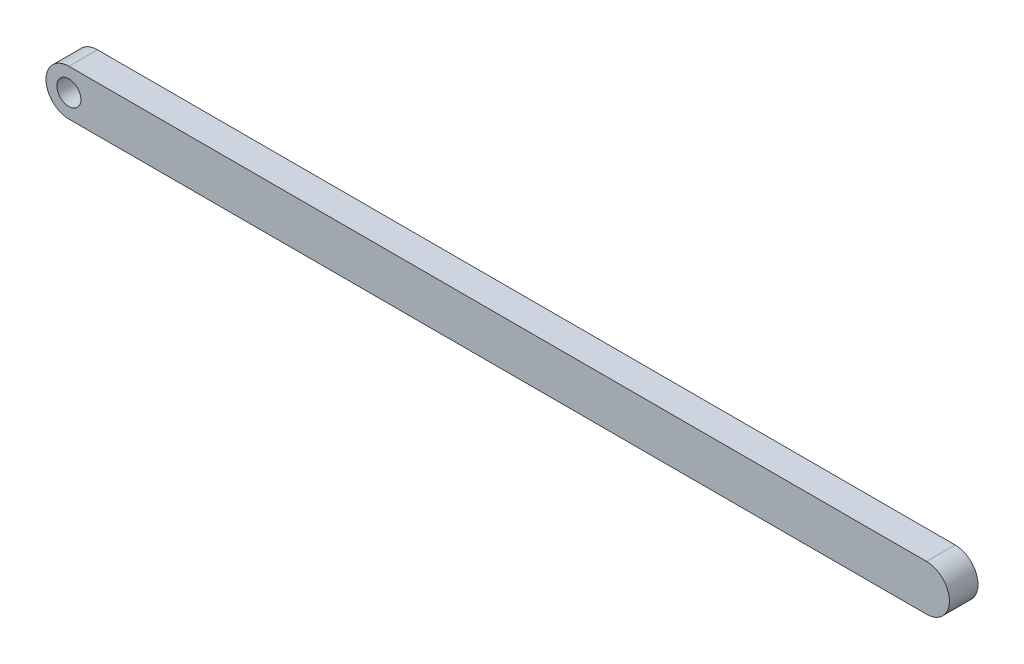
ISO-10303-21;
HEADER;
FILE_DESCRIPTION(('STEP AP214'),'2;1');
FILE_NAME('part.step','',(''),(''),'','','');
FILE_SCHEMA(('AUTOMOTIVE_DESIGN { 1 0 10303 214 1 1 1 1 }'));
ENDSEC;
DATA;
#1=APPLICATION_CONTEXT('core data for automotive mechanical design processes');
#2=APPLICATION_PROTOCOL_DEFINITION('international standard','automotive_design',2000,#1);
#3=PRODUCT_CONTEXT('',#1,'mechanical');
#4=PRODUCT('Part','Part','',(#3));
#5=PRODUCT_RELATED_PRODUCT_CATEGORY('part','',(#4));
#6=PRODUCT_DEFINITION_FORMATION('','',#4);
#7=PRODUCT_DEFINITION_CONTEXT('part definition',#1,'design');
#8=PRODUCT_DEFINITION('design','',#6,#7);
#9=PRODUCT_DEFINITION_SHAPE('','',#8);
#10=(LENGTH_UNIT() NAMED_UNIT(*) SI_UNIT(.MILLI.,.METRE.));
#11=(NAMED_UNIT(*) PLANE_ANGLE_UNIT() SI_UNIT($,.RADIAN.));
#12=(NAMED_UNIT(*) SI_UNIT($,.STERADIAN.) SOLID_ANGLE_UNIT());
#13=UNCERTAINTY_MEASURE_WITH_UNIT(LENGTH_MEASURE(1.E-05),#10,'distance_accuracy_value','');
#14=(GEOMETRIC_REPRESENTATION_CONTEXT(3) GLOBAL_UNCERTAINTY_ASSIGNED_CONTEXT((#13)) GLOBAL_UNIT_ASSIGNED_CONTEXT((#10,
#11,#12)) REPRESENTATION_CONTEXT('',''));
#15=CARTESIAN_POINT('',(0.,0.,0.));
#16=DIRECTION('',(0.,0.,1.));
#17=DIRECTION('',(1.,0.,0.));
#18=AXIS2_PLACEMENT_3D('',#15,#16,#17);
#19=CARTESIAN_POINT('',(0.,0.,2.5));
#20=DIRECTION('',(0.,0.,1.));
#21=DIRECTION('',(1.,0.,0.));
#22=AXIS2_PLACEMENT_3D('',#19,#20,#21);
#23=PLANE('',#22);
#24=CARTESIAN_POINT('',(0.,0.,2.5));
#25=DIRECTION('',(0.,0.,1.));
#26=DIRECTION('',(1.,0.,0.));
#27=AXIS2_PLACEMENT_3D('',#24,#25,#26);
#28=CIRCLE('',#27,4.);
#29=CARTESIAN_POINT('',(0.,4.,2.5));
#30=VERTEX_POINT('',#29);
#31=CARTESIAN_POINT('',(0.,-4.,2.5));
#32=VERTEX_POINT('',#31);
#33=EDGE_CURVE('E85',#30,#32,#28,.T.);
#34=ORIENTED_EDGE('',*,*,#33,.T.);
#35=DIRECTION('',(1.,0.,0.));
#36=VECTOR('',#35,1.);
#37=CARTESIAN_POINT('',(0.,-4.,2.5));
#38=LINE('',#37,#36);
#39=CARTESIAN_POINT('',(150.,-4.,2.5));
#40=VERTEX_POINT('',#39);
#41=EDGE_CURVE('E80',#32,#40,#38,.T.);
#42=ORIENTED_EDGE('',*,*,#41,.T.);
#43=CARTESIAN_POINT('',(150.,0.,2.5));
#44=DIRECTION('',(0.,0.,1.));
#45=DIRECTION('',(1.,0.,0.));
#46=AXIS2_PLACEMENT_3D('',#43,#44,#45);
#47=CIRCLE('',#46,4.);
#48=CARTESIAN_POINT('',(150.,4.,2.5));
#49=VERTEX_POINT('',#48);
#50=EDGE_CURVE('E83',#40,#49,#47,.T.);
#51=ORIENTED_EDGE('',*,*,#50,.T.);
#52=DIRECTION('',(-1.,0.,0.));
#53=VECTOR('',#52,1.);
#54=CARTESIAN_POINT('',(0.,4.,2.5));
#55=LINE('',#54,#53);
#56=EDGE_CURVE('E50',#49,#30,#55,.T.);
#57=ORIENTED_EDGE('',*,*,#56,.T.);
#58=EDGE_LOOP('',(#34,#42,#51,#57));
#59=FACE_BOUND('',#58,.T.);
#60=CARTESIAN_POINT('',(0.,0.,2.5));
#61=DIRECTION('',(0.,0.,1.));
#62=DIRECTION('',(1.,0.,0.));
#63=AXIS2_PLACEMENT_3D('',#60,#61,#62);
#64=CIRCLE('',#63,2.1);
#65=CARTESIAN_POINT('',(2.1,0.,2.5));
#66=VERTEX_POINT('',#65);
#67=EDGE_CURVE('E100',#66,#66,#64,.T.);
#68=ORIENTED_EDGE('',*,*,#67,.F.);
#69=EDGE_LOOP('',(#68));
#70=FACE_BOUND('',#69,.T.);
#71=ADVANCED_FACE('F33',(#59,#70),#23,.T.);
#72=CARTESIAN_POINT('',(0.,0.,-2.5));
#73=DIRECTION('',(0.,0.,1.));
#74=DIRECTION('',(1.,0.,0.));
#75=AXIS2_PLACEMENT_3D('',#72,#73,#74);
#76=PLANE('',#75);
#77=CARTESIAN_POINT('',(0.,0.,-2.5));
#78=DIRECTION('',(0.,0.,1.));
#79=DIRECTION('',(1.,0.,0.));
#80=AXIS2_PLACEMENT_3D('',#77,#78,#79);
#81=CIRCLE('',#80,4.);
#82=CARTESIAN_POINT('',(0.,4.,-2.5));
#83=VERTEX_POINT('',#82);
#84=CARTESIAN_POINT('',(0.,-4.,-2.5));
#85=VERTEX_POINT('',#84);
#86=EDGE_CURVE('E97',#83,#85,#81,.T.);
#87=ORIENTED_EDGE('',*,*,#86,.F.);
#88=DIRECTION('',(-1.,0.,0.));
#89=VECTOR('',#88,1.);
#90=CARTESIAN_POINT('',(0.,4.,-2.5));
#91=LINE('',#90,#89);
#92=CARTESIAN_POINT('',(150.,4.,-2.5));
#93=VERTEX_POINT('',#92);
#94=EDGE_CURVE('E73',#93,#83,#91,.T.);
#95=ORIENTED_EDGE('',*,*,#94,.F.);
#96=CARTESIAN_POINT('',(150.,0.,-2.5));
#97=DIRECTION('',(0.,0.,1.));
#98=DIRECTION('',(1.,0.,0.));
#99=AXIS2_PLACEMENT_3D('',#96,#97,#98);
#100=CIRCLE('',#99,4.);
#101=CARTESIAN_POINT('',(150.,-4.,-2.5));
#102=VERTEX_POINT('',#101);
#103=EDGE_CURVE('E67',#102,#93,#100,.T.);
#104=ORIENTED_EDGE('',*,*,#103,.F.);
#105=DIRECTION('',(1.,0.,0.));
#106=VECTOR('',#105,1.);
#107=CARTESIAN_POINT('',(0.,-4.,-2.5));
#108=LINE('',#107,#106);
#109=EDGE_CURVE('E89',#85,#102,#108,.T.);
#110=ORIENTED_EDGE('',*,*,#109,.F.);
#111=EDGE_LOOP('',(#87,#95,#104,#110));
#112=FACE_BOUND('',#111,.T.);
#113=CARTESIAN_POINT('',(0.,0.,-2.5));
#114=DIRECTION('',(0.,0.,1.));
#115=DIRECTION('',(1.,0.,0.));
#116=AXIS2_PLACEMENT_3D('',#113,#114,#115);
#117=CIRCLE('',#116,2.1);
#118=CARTESIAN_POINT('',(2.1,0.,-2.5));
#119=VERTEX_POINT('',#118);
#120=EDGE_CURVE('E112',#119,#119,#117,.T.);
#121=ORIENTED_EDGE('',*,*,#120,.T.);
#122=EDGE_LOOP('',(#121));
#123=FACE_BOUND('',#122,.T.);
#124=ADVANCED_FACE('F108',(#112,#123),#76,.F.);
#125=CARTESIAN_POINT('',(0.,0.,2.5));
#126=DIRECTION('',(0.,0.,-1.));
#127=DIRECTION('',(-1.,0.,0.));
#128=AXIS2_PLACEMENT_3D('',#125,#126,#127);
#129=CYLINDRICAL_SURFACE('',#128,4.);
#130=ORIENTED_EDGE('',*,*,#86,.T.);
#131=DIRECTION('',(0.,0.,-1.));
#132=VECTOR('',#131,1.);
#133=CARTESIAN_POINT('',(0.,-4.,2.5));
#134=LINE('',#133,#132);
#135=EDGE_CURVE('E11',#32,#85,#134,.T.);
#136=ORIENTED_EDGE('',*,*,#135,.F.);
#137=ORIENTED_EDGE('',*,*,#33,.F.);
#138=DIRECTION('',(0.,0.,-1.));
#139=VECTOR('',#138,1.);
#140=CARTESIAN_POINT('',(0.,4.,2.5));
#141=LINE('',#140,#139);
#142=EDGE_CURVE('E93',#30,#83,#141,.T.);
#143=ORIENTED_EDGE('',*,*,#142,.T.);
#144=EDGE_LOOP('',(#130,#136,#137,#143));
#145=FACE_BOUND('',#144,.T.);
#146=ADVANCED_FACE('F35',(#145),#129,.T.);
#147=CARTESIAN_POINT('',(0.,-4.,2.5));
#148=DIRECTION('',(0.,1.,0.));
#149=DIRECTION('',(0.,0.,1.));
#150=AXIS2_PLACEMENT_3D('',#147,#148,#149);
#151=PLANE('',#150);
#152=ORIENTED_EDGE('',*,*,#109,.T.);
#153=DIRECTION('',(0.,0.,-1.));
#154=VECTOR('',#153,1.);
#155=CARTESIAN_POINT('',(150.,-4.,2.5));
#156=LINE('',#155,#154);
#157=EDGE_CURVE('E42',#40,#102,#156,.T.);
#158=ORIENTED_EDGE('',*,*,#157,.F.);
#159=ORIENTED_EDGE('',*,*,#41,.F.);
#160=ORIENTED_EDGE('',*,*,#135,.T.);
#161=EDGE_LOOP('',(#152,#158,#159,#160));
#162=FACE_BOUND('',#161,.T.);
#163=ADVANCED_FACE('F88',(#162),#151,.F.);
#164=CARTESIAN_POINT('',(150.,0.,2.5));
#165=DIRECTION('',(0.,0.,-1.));
#166=DIRECTION('',(-1.,0.,0.));
#167=AXIS2_PLACEMENT_3D('',#164,#165,#166);
#168=CYLINDRICAL_SURFACE('',#167,4.);
#169=ORIENTED_EDGE('',*,*,#103,.T.);
#170=DIRECTION('',(0.,0.,-1.));
#171=VECTOR('',#170,1.);
#172=CARTESIAN_POINT('',(150.,4.,2.5));
#173=LINE('',#172,#171);
#174=EDGE_CURVE('E90',#49,#93,#173,.T.);
#175=ORIENTED_EDGE('',*,*,#174,.F.);
#176=ORIENTED_EDGE('',*,*,#50,.F.);
#177=ORIENTED_EDGE('',*,*,#157,.T.);
#178=EDGE_LOOP('',(#169,#175,#176,#177));
#179=FACE_BOUND('',#178,.T.);
#180=ADVANCED_FACE('F91',(#179),#168,.T.);
#181=CARTESIAN_POINT('',(0.,4.,2.5));
#182=DIRECTION('',(0.,-1.,0.));
#183=DIRECTION('',(0.,0.,-1.));
#184=AXIS2_PLACEMENT_3D('',#181,#182,#183);
#185=PLANE('',#184);
#186=ORIENTED_EDGE('',*,*,#94,.T.);
#187=ORIENTED_EDGE('',*,*,#142,.F.);
#188=ORIENTED_EDGE('',*,*,#56,.F.);
#189=ORIENTED_EDGE('',*,*,#174,.T.);
#190=EDGE_LOOP('',(#186,#187,#188,#189));
#191=FACE_BOUND('',#190,.T.);
#192=ADVANCED_FACE('F105',(#191),#185,.F.);
#193=CARTESIAN_POINT('',(0.,0.,2.5));
#194=DIRECTION('',(0.,0.,-1.));
#195=DIRECTION('',(-1.,0.,0.));
#196=AXIS2_PLACEMENT_3D('',#193,#194,#195);
#197=CYLINDRICAL_SURFACE('',#196,2.1);
#198=ORIENTED_EDGE('',*,*,#67,.T.);
#199=EDGE_LOOP('',(#198));
#200=FACE_BOUND('',#199,.T.);
#201=ORIENTED_EDGE('',*,*,#120,.F.);
#202=EDGE_LOOP('',(#201));
#203=FACE_BOUND('',#202,.T.);
#204=ADVANCED_FACE('F118',(#200,#203),#197,.F.);
#205=CLOSED_SHELL('',(#71,#124,#146,#163,#180,#192,#204));
#206=MANIFOLD_SOLID_BREP('B2',#205);
#207=ADVANCED_BREP_SHAPE_REPRESENTATION('',(#18,#206),#14);
#208=SHAPE_DEFINITION_REPRESENTATION(#9,#207);
ENDSEC;
END-ISO-10303-21;
